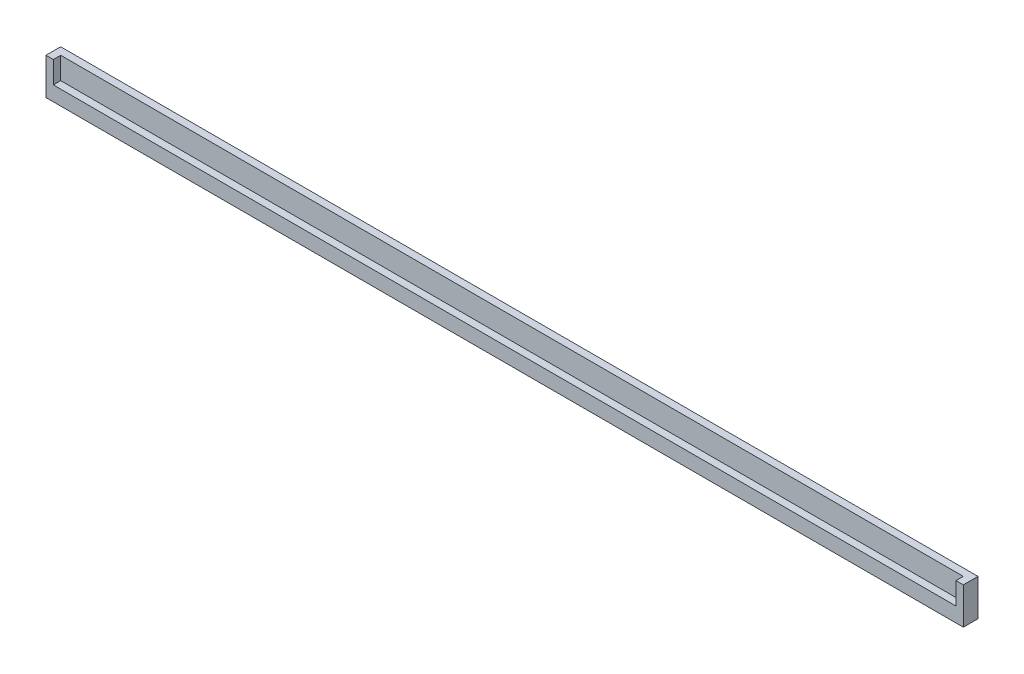
ISO-10303-21;
HEADER;
FILE_DESCRIPTION(('STEP AP214'),'2;1');
FILE_NAME('part.step','',(''),(''),'','','');
FILE_SCHEMA(('AUTOMOTIVE_DESIGN { 1 0 10303 214 1 1 1 1 }'));
ENDSEC;
DATA;
#1=APPLICATION_CONTEXT('core data for automotive mechanical design processes');
#2=APPLICATION_PROTOCOL_DEFINITION('international standard','automotive_design',2000,#1);
#3=PRODUCT_CONTEXT('',#1,'mechanical');
#4=PRODUCT('Part','Part','',(#3));
#5=PRODUCT_RELATED_PRODUCT_CATEGORY('part','',(#4));
#6=PRODUCT_DEFINITION_FORMATION('','',#4);
#7=PRODUCT_DEFINITION_CONTEXT('part definition',#1,'design');
#8=PRODUCT_DEFINITION('design','',#6,#7);
#9=PRODUCT_DEFINITION_SHAPE('','',#8);
#10=(LENGTH_UNIT() NAMED_UNIT(*) SI_UNIT(.MILLI.,.METRE.));
#11=(NAMED_UNIT(*) PLANE_ANGLE_UNIT() SI_UNIT($,.RADIAN.));
#12=(NAMED_UNIT(*) SI_UNIT($,.STERADIAN.) SOLID_ANGLE_UNIT());
#13=UNCERTAINTY_MEASURE_WITH_UNIT(LENGTH_MEASURE(1.E-05),#10,'distance_accuracy_value','');
#14=(GEOMETRIC_REPRESENTATION_CONTEXT(3) GLOBAL_UNCERTAINTY_ASSIGNED_CONTEXT((#13)) GLOBAL_UNIT_ASSIGNED_CONTEXT((#10,
#11,#12)) REPRESENTATION_CONTEXT('',''));
#15=CARTESIAN_POINT('',(0.,0.,0.));
#16=DIRECTION('',(0.,0.,1.));
#17=DIRECTION('',(1.,0.,0.));
#18=AXIS2_PLACEMENT_3D('',#15,#16,#17);
#19=CARTESIAN_POINT('',(-115.385194250437,5.67488151658766,8.));
#20=DIRECTION('',(1.,0.,0.));
#21=DIRECTION('',(0.,0.,-1.));
#22=AXIS2_PLACEMENT_3D('',#19,#20,#21);
#23=PLANE('',#22);
#24=DIRECTION('',(0.,-1.,0.));
#25=VECTOR('',#24,1.);
#26=CARTESIAN_POINT('',(-115.385194250437,5.67488151658766,0.));
#27=LINE('',#26,#25);
#28=CARTESIAN_POINT('',(-115.385194250437,5.67488151658766,0.));
#29=VERTEX_POINT('',#28);
#30=CARTESIAN_POINT('',(-115.385194250437,-14.3251184834123,0.));
#31=VERTEX_POINT('',#30);
#32=EDGE_CURVE('E136',#29,#31,#27,.T.);
#33=ORIENTED_EDGE('',*,*,#32,.T.);
#34=DIRECTION('',(0.,0.,-1.));
#35=VECTOR('',#34,1.);
#36=CARTESIAN_POINT('',(-115.385194250437,-14.3251184834123,8.));
#37=LINE('',#36,#35);
#38=CARTESIAN_POINT('',(-115.385194250437,-14.3251184834123,8.));
#39=VERTEX_POINT('',#38);
#40=EDGE_CURVE('E11',#39,#31,#37,.T.);
#41=ORIENTED_EDGE('',*,*,#40,.F.);
#42=DIRECTION('',(0.,-1.,0.));
#43=VECTOR('',#42,1.);
#44=CARTESIAN_POINT('',(-115.385194250437,5.67488151658766,8.));
#45=LINE('',#44,#43);
#46=CARTESIAN_POINT('',(-115.385194250437,5.67488151658766,8.));
#47=VERTEX_POINT('',#46);
#48=EDGE_CURVE('E141',#47,#39,#45,.T.);
#49=ORIENTED_EDGE('',*,*,#48,.F.);
#50=DIRECTION('',(0.,0.,-1.));
#51=VECTOR('',#50,1.);
#52=CARTESIAN_POINT('',(-115.385194250437,5.67488151658766,8.));
#53=LINE('',#52,#51);
#54=EDGE_CURVE('E149',#47,#29,#53,.T.);
#55=ORIENTED_EDGE('',*,*,#54,.T.);
#56=EDGE_LOOP('',(#33,#41,#49,#55));
#57=FACE_BOUND('',#56,.T.);
#58=ADVANCED_FACE('F32',(#57),#23,.F.);
#59=CARTESIAN_POINT('',(-115.385194250437,-14.3251184834123,8.));
#60=DIRECTION('',(0.,1.,0.));
#61=DIRECTION('',(0.,0.,1.));
#62=AXIS2_PLACEMENT_3D('',#59,#60,#61);
#63=PLANE('',#62);
#64=DIRECTION('',(1.,0.,0.));
#65=VECTOR('',#64,1.);
#66=CARTESIAN_POINT('',(-115.385194250437,-14.3251184834123,0.));
#67=LINE('',#66,#65);
#68=CARTESIAN_POINT('',(384.614805749563,-14.3251184834123,0.));
#69=VERTEX_POINT('',#68);
#70=EDGE_CURVE('E152',#31,#69,#67,.T.);
#71=ORIENTED_EDGE('',*,*,#70,.T.);
#72=DIRECTION('',(0.,0.,-1.));
#73=VECTOR('',#72,1.);
#74=CARTESIAN_POINT('',(384.614805749563,-14.3251184834123,8.));
#75=LINE('',#74,#73);
#76=CARTESIAN_POINT('',(384.614805749563,-14.3251184834123,8.));
#77=VERTEX_POINT('',#76);
#78=EDGE_CURVE('E39',#77,#69,#75,.T.);
#79=ORIENTED_EDGE('',*,*,#78,.F.);
#80=DIRECTION('',(1.,0.,0.));
#81=VECTOR('',#80,1.);
#82=CARTESIAN_POINT('',(-115.385194250437,-14.3251184834123,8.));
#83=LINE('',#82,#81);
#84=EDGE_CURVE('E83',#39,#77,#83,.T.);
#85=ORIENTED_EDGE('',*,*,#84,.F.);
#86=ORIENTED_EDGE('',*,*,#40,.T.);
#87=EDGE_LOOP('',(#71,#79,#85,#86));
#88=FACE_BOUND('',#87,.T.);
#89=ADVANCED_FACE('F187',(#88),#63,.F.);
#90=CARTESIAN_POINT('',(384.614805749563,5.67488151658766,8.));
#91=DIRECTION('',(-1.,0.,0.));
#92=DIRECTION('',(0.,0.,1.));
#93=AXIS2_PLACEMENT_3D('',#90,#91,#92);
#94=PLANE('',#93);
#95=DIRECTION('',(0.,1.,0.));
#96=VECTOR('',#95,1.);
#97=CARTESIAN_POINT('',(384.614805749563,5.67488151658766,0.));
#98=LINE('',#97,#96);
#99=CARTESIAN_POINT('',(384.614805749563,5.67488151658766,0.));
#100=VERTEX_POINT('',#99);
#101=EDGE_CURVE('E154',#69,#100,#98,.T.);
#102=ORIENTED_EDGE('',*,*,#101,.T.);
#103=DIRECTION('',(0.,0.,-1.));
#104=VECTOR('',#103,1.);
#105=CARTESIAN_POINT('',(384.614805749563,5.67488151658766,8.));
#106=LINE('',#105,#104);
#107=CARTESIAN_POINT('',(384.614805749563,5.67488151658766,8.));
#108=VERTEX_POINT('',#107);
#109=EDGE_CURVE('E158',#108,#100,#106,.T.);
#110=ORIENTED_EDGE('',*,*,#109,.F.);
#111=DIRECTION('',(0.,1.,0.));
#112=VECTOR('',#111,1.);
#113=CARTESIAN_POINT('',(384.614805749563,5.67488151658766,8.));
#114=LINE('',#113,#112);
#115=EDGE_CURVE('E144',#77,#108,#114,.T.);
#116=ORIENTED_EDGE('',*,*,#115,.F.);
#117=ORIENTED_EDGE('',*,*,#78,.T.);
#118=EDGE_LOOP('',(#102,#110,#116,#117));
#119=FACE_BOUND('',#118,.T.);
#120=ADVANCED_FACE('F163',(#119),#94,.F.);
#121=CARTESIAN_POINT('',(-115.385194250437,5.67488151658766,8.));
#122=DIRECTION('',(0.,-1.,0.));
#123=DIRECTION('',(0.,0.,-1.));
#124=AXIS2_PLACEMENT_3D('',#121,#122,#123);
#125=PLANE('',#124);
#126=DIRECTION('',(-1.,0.,0.));
#127=VECTOR('',#126,1.);
#128=CARTESIAN_POINT('',(-115.385194250437,5.67488151658766,8.));
#129=LINE('',#128,#127);
#130=CARTESIAN_POINT('',(-111.385194250437,5.67488151658766,8.));
#131=VERTEX_POINT('',#130);
#132=EDGE_CURVE('E54',#131,#47,#129,.T.);
#133=ORIENTED_EDGE('',*,*,#132,.F.);
#134=DIRECTION('',(0.,0.,1.));
#135=VECTOR('',#134,1.);
#136=CARTESIAN_POINT('',(-111.385194250437,5.67488151658766,4.));
#137=LINE('',#136,#135);
#138=CARTESIAN_POINT('',(-111.385194250437,5.67488151658766,4.));
#139=VERTEX_POINT('',#138);
#140=EDGE_CURVE('E134',#139,#131,#137,.T.);
#141=ORIENTED_EDGE('',*,*,#140,.F.);
#142=DIRECTION('',(-1.,0.,0.));
#143=VECTOR('',#142,1.);
#144=CARTESIAN_POINT('',(-111.385194250437,5.67488151658766,4.));
#145=LINE('',#144,#143);
#146=CARTESIAN_POINT('',(380.614805749563,5.67488151658766,4.));
#147=VERTEX_POINT('',#146);
#148=EDGE_CURVE('E112',#147,#139,#145,.T.);
#149=ORIENTED_EDGE('',*,*,#148,.F.);
#150=DIRECTION('',(0.,0.,1.));
#151=VECTOR('',#150,1.);
#152=CARTESIAN_POINT('',(380.614805749563,5.67488151658766,4.));
#153=LINE('',#152,#151);
#154=CARTESIAN_POINT('',(380.614805749563,5.67488151658766,8.));
#155=VERTEX_POINT('',#154);
#156=EDGE_CURVE('E137',#147,#155,#153,.T.);
#157=ORIENTED_EDGE('',*,*,#156,.T.);
#158=EDGE_CURVE('E146',#108,#155,#129,.T.);
#159=ORIENTED_EDGE('',*,*,#158,.F.);
#160=ORIENTED_EDGE('',*,*,#109,.T.);
#161=DIRECTION('',(-1.,0.,0.));
#162=VECTOR('',#161,1.);
#163=CARTESIAN_POINT('',(-115.385194250437,5.67488151658766,0.));
#164=LINE('',#163,#162);
#165=EDGE_CURVE('E76',#100,#29,#164,.T.);
#166=ORIENTED_EDGE('',*,*,#165,.T.);
#167=ORIENTED_EDGE('',*,*,#54,.F.);
#168=EDGE_LOOP('',(#133,#141,#149,#157,#159,#160,#166,#167));
#169=FACE_BOUND('',#168,.T.);
#170=ADVANCED_FACE('F171',(#169),#125,.F.);
#171=CARTESIAN_POINT('',(0.,0.,8.));
#172=DIRECTION('',(0.,0.,1.));
#173=DIRECTION('',(1.,0.,0.));
#174=AXIS2_PLACEMENT_3D('',#171,#172,#173);
#175=PLANE('',#174);
#176=DIRECTION('',(0.,-1.,0.));
#177=VECTOR('',#176,1.);
#178=CARTESIAN_POINT('',(-111.385194250437,5.67488151658766,8.));
#179=LINE('',#178,#177);
#180=CARTESIAN_POINT('',(-111.385194250437,-6.32511848341234,8.));
#181=VERTEX_POINT('',#180);
#182=EDGE_CURVE('E46',#131,#181,#179,.T.);
#183=ORIENTED_EDGE('',*,*,#182,.F.);
#184=ORIENTED_EDGE('',*,*,#132,.T.);
#185=ORIENTED_EDGE('',*,*,#48,.T.);
#186=ORIENTED_EDGE('',*,*,#84,.T.);
#187=ORIENTED_EDGE('',*,*,#115,.T.);
#188=ORIENTED_EDGE('',*,*,#158,.T.);
#189=DIRECTION('',(0.,1.,0.));
#190=VECTOR('',#189,1.);
#191=CARTESIAN_POINT('',(380.614805749563,5.67488151658766,8.));
#192=LINE('',#191,#190);
#193=CARTESIAN_POINT('',(380.614805749563,-6.32511848341234,8.));
#194=VERTEX_POINT('',#193);
#195=EDGE_CURVE('E125',#194,#155,#192,.T.);
#196=ORIENTED_EDGE('',*,*,#195,.F.);
#197=DIRECTION('',(1.,0.,0.));
#198=VECTOR('',#197,1.);
#199=CARTESIAN_POINT('',(-111.385194250437,-6.32511848341234,8.));
#200=LINE('',#199,#198);
#201=EDGE_CURVE('E127',#181,#194,#200,.T.);
#202=ORIENTED_EDGE('',*,*,#201,.F.);
#203=EDGE_LOOP('',(#183,#184,#185,#186,#187,#188,#196,#202));
#204=FACE_BOUND('',#203,.T.);
#205=ADVANCED_FACE('F172',(#204),#175,.T.);
#206=CARTESIAN_POINT('',(0.,0.,0.));
#207=DIRECTION('',(0.,0.,1.));
#208=DIRECTION('',(1.,0.,0.));
#209=AXIS2_PLACEMENT_3D('',#206,#207,#208);
#210=PLANE('',#209);
#211=ORIENTED_EDGE('',*,*,#32,.F.);
#212=ORIENTED_EDGE('',*,*,#165,.F.);
#213=ORIENTED_EDGE('',*,*,#101,.F.);
#214=ORIENTED_EDGE('',*,*,#70,.F.);
#215=EDGE_LOOP('',(#211,#212,#213,#214));
#216=FACE_BOUND('',#215,.T.);
#217=ADVANCED_FACE('F167',(#216),#210,.F.);
#218=CARTESIAN_POINT('',(-111.385194250437,5.67488151658766,4.));
#219=DIRECTION('',(-1.,0.,0.));
#220=DIRECTION('',(0.,0.,1.));
#221=AXIS2_PLACEMENT_3D('',#218,#219,#220);
#222=PLANE('',#221);
#223=ORIENTED_EDGE('',*,*,#182,.T.);
#224=DIRECTION('',(0.,0.,1.));
#225=VECTOR('',#224,1.);
#226=CARTESIAN_POINT('',(-111.385194250437,-6.32511848341234,4.));
#227=LINE('',#226,#225);
#228=CARTESIAN_POINT('',(-111.385194250437,-6.32511848341234,4.));
#229=VERTEX_POINT('',#228);
#230=EDGE_CURVE('E102',#229,#181,#227,.T.);
#231=ORIENTED_EDGE('',*,*,#230,.F.);
#232=DIRECTION('',(0.,-1.,0.));
#233=VECTOR('',#232,1.);
#234=CARTESIAN_POINT('',(-111.385194250437,5.67488151658766,4.));
#235=LINE('',#234,#233);
#236=EDGE_CURVE('E106',#139,#229,#235,.T.);
#237=ORIENTED_EDGE('',*,*,#236,.F.);
#238=ORIENTED_EDGE('',*,*,#140,.T.);
#239=EDGE_LOOP('',(#223,#231,#237,#238));
#240=FACE_BOUND('',#239,.T.);
#241=ADVANCED_FACE('F104',(#240),#222,.F.);
#242=CARTESIAN_POINT('',(380.614805749563,5.67488151658766,4.));
#243=DIRECTION('',(1.,0.,0.));
#244=DIRECTION('',(0.,0.,-1.));
#245=AXIS2_PLACEMENT_3D('',#242,#243,#244);
#246=PLANE('',#245);
#247=ORIENTED_EDGE('',*,*,#195,.T.);
#248=ORIENTED_EDGE('',*,*,#156,.F.);
#249=DIRECTION('',(0.,1.,0.));
#250=VECTOR('',#249,1.);
#251=CARTESIAN_POINT('',(380.614805749563,5.67488151658766,4.));
#252=LINE('',#251,#250);
#253=CARTESIAN_POINT('',(380.614805749563,-6.32511848341234,4.));
#254=VERTEX_POINT('',#253);
#255=EDGE_CURVE('E120',#254,#147,#252,.T.);
#256=ORIENTED_EDGE('',*,*,#255,.F.);
#257=DIRECTION('',(0.,0.,1.));
#258=VECTOR('',#257,1.);
#259=CARTESIAN_POINT('',(380.614805749563,-6.32511848341234,4.));
#260=LINE('',#259,#258);
#261=EDGE_CURVE('E111',#254,#194,#260,.T.);
#262=ORIENTED_EDGE('',*,*,#261,.T.);
#263=EDGE_LOOP('',(#247,#248,#256,#262));
#264=FACE_BOUND('',#263,.T.);
#265=ADVANCED_FACE('F176',(#264),#246,.F.);
#266=CARTESIAN_POINT('',(-111.385194250437,-6.32511848341234,4.));
#267=DIRECTION('',(0.,-1.,0.));
#268=DIRECTION('',(0.,0.,-1.));
#269=AXIS2_PLACEMENT_3D('',#266,#267,#268);
#270=PLANE('',#269);
#271=ORIENTED_EDGE('',*,*,#201,.T.);
#272=ORIENTED_EDGE('',*,*,#261,.F.);
#273=DIRECTION('',(1.,0.,0.));
#274=VECTOR('',#273,1.);
#275=CARTESIAN_POINT('',(-111.385194250437,-6.32511848341234,4.));
#276=LINE('',#275,#274);
#277=EDGE_CURVE('E115',#229,#254,#276,.T.);
#278=ORIENTED_EDGE('',*,*,#277,.F.);
#279=ORIENTED_EDGE('',*,*,#230,.T.);
#280=EDGE_LOOP('',(#271,#272,#278,#279));
#281=FACE_BOUND('',#280,.T.);
#282=ADVANCED_FACE('F116',(#281),#270,.F.);
#283=CARTESIAN_POINT('',(0.,0.,4.));
#284=DIRECTION('',(0.,0.,1.));
#285=DIRECTION('',(1.,0.,0.));
#286=AXIS2_PLACEMENT_3D('',#283,#284,#285);
#287=PLANE('',#286);
#288=ORIENTED_EDGE('',*,*,#236,.T.);
#289=ORIENTED_EDGE('',*,*,#277,.T.);
#290=ORIENTED_EDGE('',*,*,#255,.T.);
#291=ORIENTED_EDGE('',*,*,#148,.T.);
#292=EDGE_LOOP('',(#288,#289,#290,#291));
#293=FACE_BOUND('',#292,.T.);
#294=ADVANCED_FACE('F122',(#293),#287,.T.);
#295=CLOSED_SHELL('',(#58,#89,#120,#170,#205,#217,#241,#265,#282,#294));
#296=MANIFOLD_SOLID_BREP('B2',#295);
#297=ADVANCED_BREP_SHAPE_REPRESENTATION('',(#18,#296),#14);
#298=SHAPE_DEFINITION_REPRESENTATION(#9,#297);
ENDSEC;
END-ISO-10303-21;
